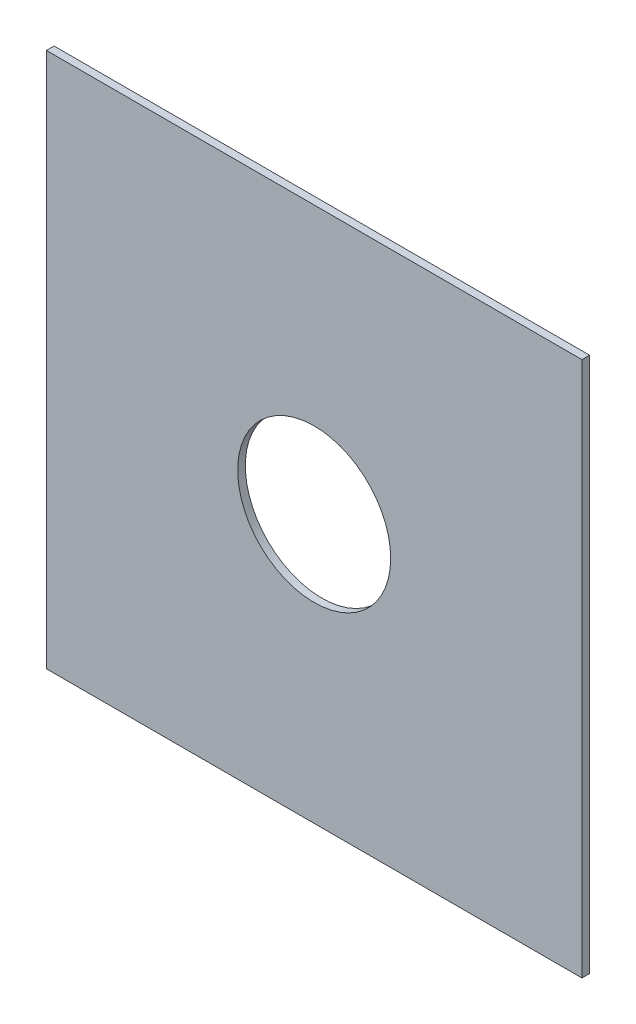
ISO-10303-21;
HEADER;
FILE_DESCRIPTION(('STEP AP214'),'2;1');
FILE_NAME('part.step','',(''),(''),'','','');
FILE_SCHEMA(('AUTOMOTIVE_DESIGN { 1 0 10303 214 1 1 1 1 }'));
ENDSEC;
DATA;
#1=APPLICATION_CONTEXT('core data for automotive mechanical design processes');
#2=APPLICATION_PROTOCOL_DEFINITION('international standard','automotive_design',2000,#1);
#3=PRODUCT_CONTEXT('',#1,'mechanical');
#4=PRODUCT('Part','Part','',(#3));
#5=PRODUCT_RELATED_PRODUCT_CATEGORY('part','',(#4));
#6=PRODUCT_DEFINITION_FORMATION('','',#4);
#7=PRODUCT_DEFINITION_CONTEXT('part definition',#1,'design');
#8=PRODUCT_DEFINITION('design','',#6,#7);
#9=PRODUCT_DEFINITION_SHAPE('','',#8);
#10=(LENGTH_UNIT() NAMED_UNIT(*) SI_UNIT(.MILLI.,.METRE.));
#11=(NAMED_UNIT(*) PLANE_ANGLE_UNIT() SI_UNIT($,.RADIAN.));
#12=(NAMED_UNIT(*) SI_UNIT($,.STERADIAN.) SOLID_ANGLE_UNIT());
#13=UNCERTAINTY_MEASURE_WITH_UNIT(LENGTH_MEASURE(1.E-05),#10,'distance_accuracy_value','');
#14=(GEOMETRIC_REPRESENTATION_CONTEXT(3) GLOBAL_UNCERTAINTY_ASSIGNED_CONTEXT((#13)) GLOBAL_UNIT_ASSIGNED_CONTEXT((#10,
#11,#12)) REPRESENTATION_CONTEXT('',''));
#15=CARTESIAN_POINT('',(0.,0.,0.));
#16=DIRECTION('',(0.,0.,1.));
#17=DIRECTION('',(1.,0.,0.));
#18=AXIS2_PLACEMENT_3D('',#15,#16,#17);
#19=CARTESIAN_POINT('',(0.,0.,10.));
#20=DIRECTION('',(0.,0.,1.));
#21=DIRECTION('',(1.,0.,0.));
#22=AXIS2_PLACEMENT_3D('',#19,#20,#21);
#23=PLANE('',#22);
#24=DIRECTION('',(0.,-1.,0.));
#25=VECTOR('',#24,1.);
#26=CARTESIAN_POINT('',(-49.8973103010784,30.8410510906163,10.));
#27=LINE('',#26,#25);
#28=CARTESIAN_POINT('',(-49.8973103010784,30.8410510906163,10.));
#29=VERTEX_POINT('',#28);
#30=CARTESIAN_POINT('',(-49.8973103010784,-669.158948909384,10.));
#31=VERTEX_POINT('',#30);
#32=EDGE_CURVE('E87',#29,#31,#27,.T.);
#33=ORIENTED_EDGE('',*,*,#32,.T.);
#34=DIRECTION('',(1.,0.,0.));
#35=VECTOR('',#34,1.);
#36=CARTESIAN_POINT('',(-49.8973103010784,-669.158948909384,10.));
#37=LINE('',#36,#35);
#38=CARTESIAN_POINT('',(650.102689698921,-669.158948909384,10.));
#39=VERTEX_POINT('',#38);
#40=EDGE_CURVE('E82',#31,#39,#37,.T.);
#41=ORIENTED_EDGE('',*,*,#40,.T.);
#42=DIRECTION('',(0.,1.,0.));
#43=VECTOR('',#42,1.);
#44=CARTESIAN_POINT('',(650.102689698921,30.8410510906163,10.));
#45=LINE('',#44,#43);
#46=CARTESIAN_POINT('',(650.102689698921,30.8410510906163,10.));
#47=VERTEX_POINT('',#46);
#48=EDGE_CURVE('E85',#39,#47,#45,.T.);
#49=ORIENTED_EDGE('',*,*,#48,.T.);
#50=DIRECTION('',(-1.,0.,0.));
#51=VECTOR('',#50,1.);
#52=CARTESIAN_POINT('',(-49.8973103010784,30.8410510906163,10.));
#53=LINE('',#52,#51);
#54=EDGE_CURVE('E52',#47,#29,#53,.T.);
#55=ORIENTED_EDGE('',*,*,#54,.T.);
#56=EDGE_LOOP('',(#33,#41,#49,#55));
#57=FACE_BOUND('',#56,.T.);
#58=CARTESIAN_POINT('',(300.102689698922,-319.158948909384,10.));
#59=DIRECTION('',(0.,0.,1.));
#60=DIRECTION('',(1.,0.,0.));
#61=AXIS2_PLACEMENT_3D('',#58,#59,#60);
#62=CIRCLE('',#61,100.);
#63=CARTESIAN_POINT('',(400.102689698922,-319.158948909384,10.));
#64=VERTEX_POINT('',#63);
#65=EDGE_CURVE('E102',#64,#64,#62,.T.);
#66=ORIENTED_EDGE('',*,*,#65,.F.);
#67=EDGE_LOOP('',(#66));
#68=FACE_BOUND('',#67,.T.);
#69=ADVANCED_FACE('F35',(#57,#68),#23,.T.);
#70=CARTESIAN_POINT('',(0.,0.,0.));
#71=DIRECTION('',(0.,0.,1.));
#72=DIRECTION('',(1.,0.,0.));
#73=AXIS2_PLACEMENT_3D('',#70,#71,#72);
#74=PLANE('',#73);
#75=DIRECTION('',(0.,-1.,0.));
#76=VECTOR('',#75,1.);
#77=CARTESIAN_POINT('',(-49.8973103010784,30.8410510906163,0.));
#78=LINE('',#77,#76);
#79=CARTESIAN_POINT('',(-49.8973103010784,30.8410510906163,0.));
#80=VERTEX_POINT('',#79);
#81=CARTESIAN_POINT('',(-49.8973103010784,-669.158948909384,0.));
#82=VERTEX_POINT('',#81);
#83=EDGE_CURVE('E99',#80,#82,#78,.T.);
#84=ORIENTED_EDGE('',*,*,#83,.F.);
#85=DIRECTION('',(-1.,0.,0.));
#86=VECTOR('',#85,1.);
#87=CARTESIAN_POINT('',(-49.8973103010784,30.8410510906163,0.));
#88=LINE('',#87,#86);
#89=CARTESIAN_POINT('',(650.102689698921,30.8410510906163,0.));
#90=VERTEX_POINT('',#89);
#91=EDGE_CURVE('E75',#90,#80,#88,.T.);
#92=ORIENTED_EDGE('',*,*,#91,.F.);
#93=DIRECTION('',(0.,1.,0.));
#94=VECTOR('',#93,1.);
#95=CARTESIAN_POINT('',(650.102689698921,30.8410510906163,0.));
#96=LINE('',#95,#94);
#97=CARTESIAN_POINT('',(650.102689698921,-669.158948909384,0.));
#98=VERTEX_POINT('',#97);
#99=EDGE_CURVE('E69',#98,#90,#96,.T.);
#100=ORIENTED_EDGE('',*,*,#99,.F.);
#101=DIRECTION('',(1.,0.,0.));
#102=VECTOR('',#101,1.);
#103=CARTESIAN_POINT('',(-49.8973103010784,-669.158948909384,0.));
#104=LINE('',#103,#102);
#105=EDGE_CURVE('E91',#82,#98,#104,.T.);
#106=ORIENTED_EDGE('',*,*,#105,.F.);
#107=EDGE_LOOP('',(#84,#92,#100,#106));
#108=FACE_BOUND('',#107,.T.);
#109=CARTESIAN_POINT('',(300.102689698922,-319.158948909384,0.));
#110=DIRECTION('',(0.,0.,1.));
#111=DIRECTION('',(1.,0.,0.));
#112=AXIS2_PLACEMENT_3D('',#109,#110,#111);
#113=CIRCLE('',#112,100.);
#114=CARTESIAN_POINT('',(400.102689698922,-319.158948909384,0.));
#115=VERTEX_POINT('',#114);
#116=EDGE_CURVE('E114',#115,#115,#113,.T.);
#117=ORIENTED_EDGE('',*,*,#116,.T.);
#118=EDGE_LOOP('',(#117));
#119=FACE_BOUND('',#118,.T.);
#120=ADVANCED_FACE('F110',(#108,#119),#74,.F.);
#121=CARTESIAN_POINT('',(-49.8973103010784,30.8410510906163,10.));
#122=DIRECTION('',(1.,0.,0.));
#123=DIRECTION('',(0.,0.,-1.));
#124=AXIS2_PLACEMENT_3D('',#121,#122,#123);
#125=PLANE('',#124);
#126=ORIENTED_EDGE('',*,*,#83,.T.);
#127=DIRECTION('',(0.,0.,-1.));
#128=VECTOR('',#127,1.);
#129=CARTESIAN_POINT('',(-49.8973103010784,-669.158948909384,10.));
#130=LINE('',#129,#128);
#131=EDGE_CURVE('E11',#31,#82,#130,.T.);
#132=ORIENTED_EDGE('',*,*,#131,.F.);
#133=ORIENTED_EDGE('',*,*,#32,.F.);
#134=DIRECTION('',(0.,0.,-1.));
#135=VECTOR('',#134,1.);
#136=CARTESIAN_POINT('',(-49.8973103010784,30.8410510906163,10.));
#137=LINE('',#136,#135);
#138=EDGE_CURVE('E95',#29,#80,#137,.T.);
#139=ORIENTED_EDGE('',*,*,#138,.T.);
#140=EDGE_LOOP('',(#126,#132,#133,#139));
#141=FACE_BOUND('',#140,.T.);
#142=ADVANCED_FACE('F37',(#141),#125,.F.);
#143=CARTESIAN_POINT('',(-49.8973103010784,-669.158948909384,10.));
#144=DIRECTION('',(0.,1.,0.));
#145=DIRECTION('',(0.,0.,1.));
#146=AXIS2_PLACEMENT_3D('',#143,#144,#145);
#147=PLANE('',#146);
#148=ORIENTED_EDGE('',*,*,#105,.T.);
#149=DIRECTION('',(0.,0.,-1.));
#150=VECTOR('',#149,1.);
#151=CARTESIAN_POINT('',(650.102689698921,-669.158948909384,10.));
#152=LINE('',#151,#150);
#153=EDGE_CURVE('E44',#39,#98,#152,.T.);
#154=ORIENTED_EDGE('',*,*,#153,.F.);
#155=ORIENTED_EDGE('',*,*,#40,.F.);
#156=ORIENTED_EDGE('',*,*,#131,.T.);
#157=EDGE_LOOP('',(#148,#154,#155,#156));
#158=FACE_BOUND('',#157,.T.);
#159=ADVANCED_FACE('F90',(#158),#147,.F.);
#160=CARTESIAN_POINT('',(650.102689698921,30.8410510906163,10.));
#161=DIRECTION('',(-1.,0.,0.));
#162=DIRECTION('',(0.,0.,1.));
#163=AXIS2_PLACEMENT_3D('',#160,#161,#162);
#164=PLANE('',#163);
#165=ORIENTED_EDGE('',*,*,#99,.T.);
#166=DIRECTION('',(0.,0.,-1.));
#167=VECTOR('',#166,1.);
#168=CARTESIAN_POINT('',(650.102689698921,30.8410510906163,10.));
#169=LINE('',#168,#167);
#170=EDGE_CURVE('E92',#47,#90,#169,.T.);
#171=ORIENTED_EDGE('',*,*,#170,.F.);
#172=ORIENTED_EDGE('',*,*,#48,.F.);
#173=ORIENTED_EDGE('',*,*,#153,.T.);
#174=EDGE_LOOP('',(#165,#171,#172,#173));
#175=FACE_BOUND('',#174,.T.);
#176=ADVANCED_FACE('F93',(#175),#164,.F.);
#177=CARTESIAN_POINT('',(-49.8973103010784,30.8410510906163,10.));
#178=DIRECTION('',(0.,-1.,0.));
#179=DIRECTION('',(0.,0.,-1.));
#180=AXIS2_PLACEMENT_3D('',#177,#178,#179);
#181=PLANE('',#180);
#182=ORIENTED_EDGE('',*,*,#91,.T.);
#183=ORIENTED_EDGE('',*,*,#138,.F.);
#184=ORIENTED_EDGE('',*,*,#54,.F.);
#185=ORIENTED_EDGE('',*,*,#170,.T.);
#186=EDGE_LOOP('',(#182,#183,#184,#185));
#187=FACE_BOUND('',#186,.T.);
#188=ADVANCED_FACE('F107',(#187),#181,.F.);
#189=CARTESIAN_POINT('',(300.102689698922,-319.158948909384,10.));
#190=DIRECTION('',(0.,0.,-1.));
#191=DIRECTION('',(-1.,0.,0.));
#192=AXIS2_PLACEMENT_3D('',#189,#190,#191);
#193=CYLINDRICAL_SURFACE('',#192,100.);
#194=ORIENTED_EDGE('',*,*,#65,.T.);
#195=EDGE_LOOP('',(#194));
#196=FACE_BOUND('',#195,.T.);
#197=ORIENTED_EDGE('',*,*,#116,.F.);
#198=EDGE_LOOP('',(#197));
#199=FACE_BOUND('',#198,.T.);
#200=ADVANCED_FACE('F120',(#196,#199),#193,.F.);
#201=CLOSED_SHELL('',(#69,#120,#142,#159,#176,#188,#200));
#202=MANIFOLD_SOLID_BREP('B2',#201);
#203=ADVANCED_BREP_SHAPE_REPRESENTATION('',(#18,#202),#14);
#204=SHAPE_DEFINITION_REPRESENTATION(#9,#203);
ENDSEC;
END-ISO-10303-21;
